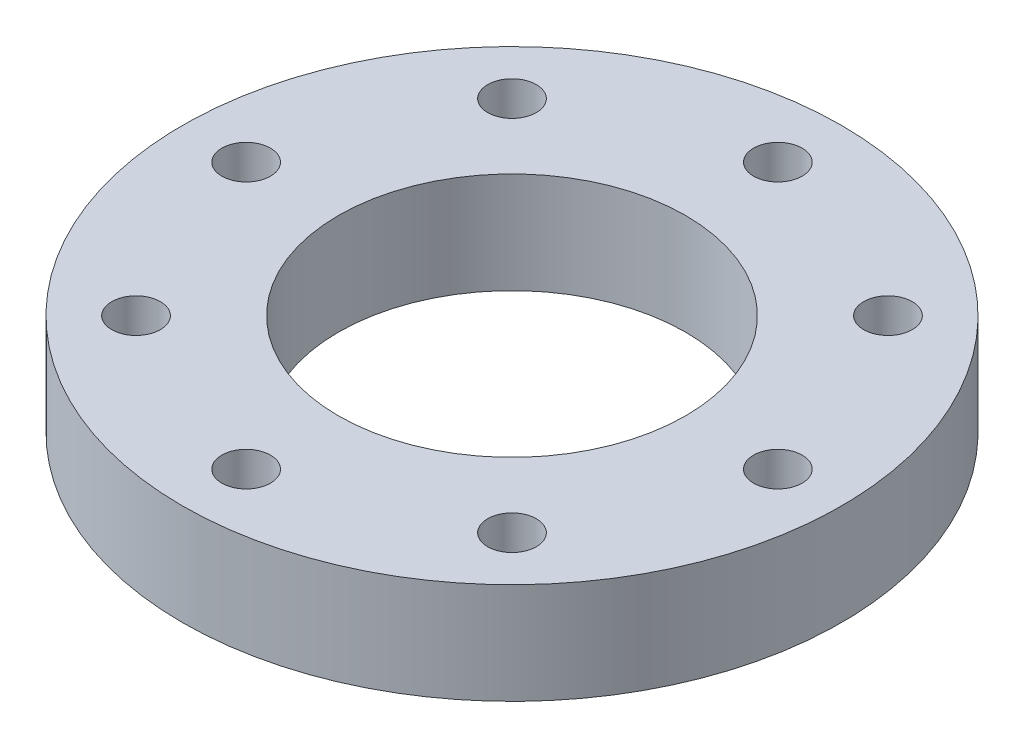
ISO-10303-21;
HEADER;
FILE_DESCRIPTION(('STEP AP214'),'2;1');
FILE_NAME('part.step','',(''),(''),'','','');
FILE_SCHEMA(('AUTOMOTIVE_DESIGN { 1 0 10303 214 1 1 1 1 }'));
ENDSEC;
DATA;
#1=APPLICATION_CONTEXT('core data for automotive mechanical design processes');
#2=APPLICATION_PROTOCOL_DEFINITION('international standard','automotive_design',2000,#1);
#3=PRODUCT_CONTEXT('',#1,'mechanical');
#4=PRODUCT('Part','Part','',(#3));
#5=PRODUCT_RELATED_PRODUCT_CATEGORY('part','',(#4));
#6=PRODUCT_DEFINITION_FORMATION('','',#4);
#7=PRODUCT_DEFINITION_CONTEXT('part definition',#1,'design');
#8=PRODUCT_DEFINITION('design','',#6,#7);
#9=PRODUCT_DEFINITION_SHAPE('','',#8);
#10=(LENGTH_UNIT() NAMED_UNIT(*) SI_UNIT(.MILLI.,.METRE.));
#11=(NAMED_UNIT(*) PLANE_ANGLE_UNIT() SI_UNIT($,.RADIAN.));
#12=(NAMED_UNIT(*) SI_UNIT($,.STERADIAN.) SOLID_ANGLE_UNIT());
#13=UNCERTAINTY_MEASURE_WITH_UNIT(LENGTH_MEASURE(1.E-05),#10,'distance_accuracy_value','');
#14=(GEOMETRIC_REPRESENTATION_CONTEXT(3) GLOBAL_UNCERTAINTY_ASSIGNED_CONTEXT((#13)) GLOBAL_UNIT_ASSIGNED_CONTEXT((#10,
#11,#12)) REPRESENTATION_CONTEXT('',''));
#15=CARTESIAN_POINT('',(0.,0.,0.));
#16=DIRECTION('',(0.,0.,1.));
#17=DIRECTION('',(1.,0.,0.));
#18=AXIS2_PLACEMENT_3D('',#15,#16,#17);
#19=CARTESIAN_POINT('',(0.,17.526,0.));
#20=DIRECTION('',(0.,1.,0.));
#21=DIRECTION('',(0.,0.,1.));
#22=AXIS2_PLACEMENT_3D('',#19,#20,#21);
#23=PLANE('',#22);
#24=CARTESIAN_POINT('',(46.101,17.526,-4.82882343606022E-13));
#25=DIRECTION('',(0.,1.,0.));
#26=DIRECTION('',(-1.,0.,0.));
#27=AXIS2_PLACEMENT_3D('',#24,#25,#26);
#28=CIRCLE('',#27,4.2164);
#29=CARTESIAN_POINT('',(41.8846,17.526,-4.38717897854727E-13));
#30=VERTEX_POINT('',#29);
#31=EDGE_CURVE('E86',#30,#30,#28,.T.);
#32=ORIENTED_EDGE('',*,*,#31,.F.);
#33=EDGE_LOOP('',(#32));
#34=FACE_BOUND('',#33,.T.);
#35=CARTESIAN_POINT('',(3.21921562404015E-13,17.526,46.101));
#36=DIRECTION('',(0.,1.,0.));
#37=DIRECTION('',(0.,0.,-1.));
#38=AXIS2_PLACEMENT_3D('',#35,#36,#37);
#39=CIRCLE('',#38,4.2164);
#40=CARTESIAN_POINT('',(2.92478598569818E-13,17.526,41.8846));
#41=VERTEX_POINT('',#40);
#42=EDGE_CURVE('E74',#41,#41,#39,.T.);
#43=ORIENTED_EDGE('',*,*,#42,.F.);
#44=EDGE_LOOP('',(#43));
#45=FACE_BOUND('',#44,.T.);
#46=CARTESIAN_POINT('',(-46.101,17.526,1.60960781202007E-13));
#47=DIRECTION('',(0.,1.,0.));
#48=DIRECTION('',(1.,0.,0.));
#49=AXIS2_PLACEMENT_3D('',#46,#47,#48);
#50=CIRCLE('',#49,4.2164);
#51=CARTESIAN_POINT('',(-41.8846,17.526,1.46239299284909E-13));
#52=VERTEX_POINT('',#51);
#53=EDGE_CURVE('E62',#52,#52,#50,.T.);
#54=ORIENTED_EDGE('',*,*,#53,.F.);
#55=EDGE_LOOP('',(#54));
#56=FACE_BOUND('',#55,.T.);
#57=CARTESIAN_POINT('',(0.,17.526,-46.101));
#58=DIRECTION('',(0.,1.,0.));
#59=DIRECTION('',(0.,0.,1.));
#60=AXIS2_PLACEMENT_3D('',#57,#58,#59);
#61=CIRCLE('',#60,4.2164);
#62=CARTESIAN_POINT('',(0.,17.526,-41.8846));
#63=VERTEX_POINT('',#62);
#64=EDGE_CURVE('E50',#63,#63,#61,.T.);
#65=ORIENTED_EDGE('',*,*,#64,.F.);
#66=EDGE_LOOP('',(#65));
#67=FACE_BOUND('',#66,.T.);
#68=CARTESIAN_POINT('',(0.,17.526,0.));
#69=DIRECTION('',(0.,1.,0.));
#70=DIRECTION('',(0.,0.,1.));
#71=AXIS2_PLACEMENT_3D('',#68,#69,#70);
#72=CIRCLE('',#71,57.15);
#73=CARTESIAN_POINT('',(0.,17.526,57.15));
#74=VERTEX_POINT('',#73);
#75=EDGE_CURVE('E11',#74,#74,#72,.T.);
#76=ORIENTED_EDGE('',*,*,#75,.T.);
#77=EDGE_LOOP('',(#76));
#78=FACE_BOUND('',#77,.T.);
#79=CARTESIAN_POINT('',(0.,17.526,0.));
#80=DIRECTION('',(0.,1.,0.));
#81=DIRECTION('',(1.,0.,0.));
#82=AXIS2_PLACEMENT_3D('',#79,#80,#81);
#83=CIRCLE('',#82,30.099);
#84=CARTESIAN_POINT('',(30.099,17.526,0.));
#85=VERTEX_POINT('',#84);
#86=EDGE_CURVE('E45',#85,#85,#83,.T.);
#87=ORIENTED_EDGE('',*,*,#86,.F.);
#88=EDGE_LOOP('',(#87));
#89=FACE_BOUND('',#88,.T.);
#90=CARTESIAN_POINT('',(-32.5983297194811,17.526,-32.598329719481));
#91=DIRECTION('',(0.,1.,0.));
#92=DIRECTION('',(0.707106781186549,0.,0.707106781186546));
#93=AXIS2_PLACEMENT_3D('',#90,#91,#92);
#94=CIRCLE('',#93,4.2164);
#95=CARTESIAN_POINT('',(-29.6168846872861,17.526,-29.616884687286));
#96=VERTEX_POINT('',#95);
#97=EDGE_CURVE('E56',#96,#96,#94,.T.);
#98=ORIENTED_EDGE('',*,*,#97,.F.);
#99=EDGE_LOOP('',(#98));
#100=FACE_BOUND('',#99,.T.);
#101=CARTESIAN_POINT('',(-32.5983297194809,17.526,32.5983297194812));
#102=DIRECTION('',(0.,1.,0.));
#103=DIRECTION('',(0.707106781186544,0.,-0.707106781186551));
#104=AXIS2_PLACEMENT_3D('',#101,#102,#103);
#105=CIRCLE('',#104,4.2164);
#106=CARTESIAN_POINT('',(-29.6168846872859,17.526,29.6168846872862));
#107=VERTEX_POINT('',#106);
#108=EDGE_CURVE('E68',#107,#107,#105,.T.);
#109=ORIENTED_EDGE('',*,*,#108,.F.);
#110=EDGE_LOOP('',(#109));
#111=FACE_BOUND('',#110,.T.);
#112=CARTESIAN_POINT('',(32.5983297194813,17.526,32.5983297194807));
#113=DIRECTION('',(0.,1.,0.));
#114=DIRECTION('',(-0.707106781186554,0.,-0.707106781186541));
#115=AXIS2_PLACEMENT_3D('',#112,#113,#114);
#116=CIRCLE('',#115,4.2164);
#117=CARTESIAN_POINT('',(29.6168846872863,17.526,29.6168846872858));
#118=VERTEX_POINT('',#117);
#119=EDGE_CURVE('E80',#118,#118,#116,.T.);
#120=ORIENTED_EDGE('',*,*,#119,.F.);
#121=EDGE_LOOP('',(#120));
#122=FACE_BOUND('',#121,.T.);
#123=CARTESIAN_POINT('',(32.5983297194806,17.526,-32.5983297194814));
#124=DIRECTION('',(0.,1.,0.));
#125=DIRECTION('',(-0.707106781186539,0.,0.707106781186556));
#126=AXIS2_PLACEMENT_3D('',#123,#124,#125);
#127=CIRCLE('',#126,4.2164);
#128=CARTESIAN_POINT('',(29.6168846872857,17.526,-29.6168846872864));
#129=VERTEX_POINT('',#128);
#130=EDGE_CURVE('E92',#129,#129,#127,.T.);
#131=ORIENTED_EDGE('',*,*,#130,.F.);
#132=EDGE_LOOP('',(#131));
#133=FACE_BOUND('',#132,.T.);
#134=ADVANCED_FACE('F34',(#34,#45,#56,#67,#78,#89,#100,#111,#122,#133),#23,.T.);
#135=CARTESIAN_POINT('',(0.,0.,0.));
#136=DIRECTION('',(0.,1.,0.));
#137=DIRECTION('',(0.,0.,1.));
#138=AXIS2_PLACEMENT_3D('',#135,#136,#137);
#139=PLANE('',#138);
#140=CARTESIAN_POINT('',(46.101,0.,-4.82882343606022E-13));
#141=DIRECTION('',(0.,1.,0.));
#142=DIRECTION('',(-1.,0.,0.));
#143=AXIS2_PLACEMENT_3D('',#140,#141,#142);
#144=CIRCLE('',#143,4.2164);
#145=CARTESIAN_POINT('',(41.8846,0.,-4.38717897854727E-13));
#146=VERTEX_POINT('',#145);
#147=EDGE_CURVE('E89',#146,#146,#144,.T.);
#148=ORIENTED_EDGE('',*,*,#147,.T.);
#149=EDGE_LOOP('',(#148));
#150=FACE_BOUND('',#149,.T.);
#151=CARTESIAN_POINT('',(3.21921562404015E-13,0.,46.101));
#152=DIRECTION('',(0.,1.,0.));
#153=DIRECTION('',(0.,0.,-1.));
#154=AXIS2_PLACEMENT_3D('',#151,#152,#153);
#155=CIRCLE('',#154,4.2164);
#156=CARTESIAN_POINT('',(2.92478598569818E-13,0.,41.8846));
#157=VERTEX_POINT('',#156);
#158=EDGE_CURVE('E77',#157,#157,#155,.T.);
#159=ORIENTED_EDGE('',*,*,#158,.T.);
#160=EDGE_LOOP('',(#159));
#161=FACE_BOUND('',#160,.T.);
#162=CARTESIAN_POINT('',(-46.101,0.,1.60960781202007E-13));
#163=DIRECTION('',(0.,1.,0.));
#164=DIRECTION('',(1.,0.,0.));
#165=AXIS2_PLACEMENT_3D('',#162,#163,#164);
#166=CIRCLE('',#165,4.2164);
#167=CARTESIAN_POINT('',(-41.8846,0.,1.46239299284909E-13));
#168=VERTEX_POINT('',#167);
#169=EDGE_CURVE('E65',#168,#168,#166,.T.);
#170=ORIENTED_EDGE('',*,*,#169,.T.);
#171=EDGE_LOOP('',(#170));
#172=FACE_BOUND('',#171,.T.);
#173=CARTESIAN_POINT('',(0.,0.,-46.101));
#174=DIRECTION('',(0.,1.,0.));
#175=DIRECTION('',(0.,0.,1.));
#176=AXIS2_PLACEMENT_3D('',#173,#174,#175);
#177=CIRCLE('',#176,4.2164);
#178=CARTESIAN_POINT('',(0.,0.,-41.8846));
#179=VERTEX_POINT('',#178);
#180=EDGE_CURVE('E53',#179,#179,#177,.T.);
#181=ORIENTED_EDGE('',*,*,#180,.T.);
#182=EDGE_LOOP('',(#181));
#183=FACE_BOUND('',#182,.T.);
#184=CARTESIAN_POINT('',(0.,0.,0.));
#185=DIRECTION('',(0.,1.,0.));
#186=DIRECTION('',(0.,0.,1.));
#187=AXIS2_PLACEMENT_3D('',#184,#185,#186);
#188=CIRCLE('',#187,57.15);
#189=CARTESIAN_POINT('',(0.,0.,57.15));
#190=VERTEX_POINT('',#189);
#191=EDGE_CURVE('E38',#190,#190,#188,.T.);
#192=ORIENTED_EDGE('',*,*,#191,.F.);
#193=EDGE_LOOP('',(#192));
#194=FACE_BOUND('',#193,.T.);
#195=CARTESIAN_POINT('',(0.,0.,0.));
#196=DIRECTION('',(0.,1.,0.));
#197=DIRECTION('',(1.,0.,0.));
#198=AXIS2_PLACEMENT_3D('',#195,#196,#197);
#199=CIRCLE('',#198,30.099);
#200=CARTESIAN_POINT('',(30.099,0.,0.));
#201=VERTEX_POINT('',#200);
#202=EDGE_CURVE('E47',#201,#201,#199,.T.);
#203=ORIENTED_EDGE('',*,*,#202,.T.);
#204=EDGE_LOOP('',(#203));
#205=FACE_BOUND('',#204,.T.);
#206=CARTESIAN_POINT('',(-32.5983297194811,0.,-32.598329719481));
#207=DIRECTION('',(0.,1.,0.));
#208=DIRECTION('',(0.707106781186549,0.,0.707106781186546));
#209=AXIS2_PLACEMENT_3D('',#206,#207,#208);
#210=CIRCLE('',#209,4.2164);
#211=CARTESIAN_POINT('',(-29.6168846872861,0.,-29.616884687286));
#212=VERTEX_POINT('',#211);
#213=EDGE_CURVE('E59',#212,#212,#210,.T.);
#214=ORIENTED_EDGE('',*,*,#213,.T.);
#215=EDGE_LOOP('',(#214));
#216=FACE_BOUND('',#215,.T.);
#217=CARTESIAN_POINT('',(-32.5983297194809,0.,32.5983297194812));
#218=DIRECTION('',(0.,1.,0.));
#219=DIRECTION('',(0.707106781186544,0.,-0.707106781186551));
#220=AXIS2_PLACEMENT_3D('',#217,#218,#219);
#221=CIRCLE('',#220,4.2164);
#222=CARTESIAN_POINT('',(-29.6168846872859,0.,29.6168846872862));
#223=VERTEX_POINT('',#222);
#224=EDGE_CURVE('E71',#223,#223,#221,.T.);
#225=ORIENTED_EDGE('',*,*,#224,.T.);
#226=EDGE_LOOP('',(#225));
#227=FACE_BOUND('',#226,.T.);
#228=CARTESIAN_POINT('',(32.5983297194813,0.,32.5983297194807));
#229=DIRECTION('',(0.,1.,0.));
#230=DIRECTION('',(-0.707106781186554,0.,-0.707106781186541));
#231=AXIS2_PLACEMENT_3D('',#228,#229,#230);
#232=CIRCLE('',#231,4.2164);
#233=CARTESIAN_POINT('',(29.6168846872863,0.,29.6168846872858));
#234=VERTEX_POINT('',#233);
#235=EDGE_CURVE('E83',#234,#234,#232,.T.);
#236=ORIENTED_EDGE('',*,*,#235,.T.);
#237=EDGE_LOOP('',(#236));
#238=FACE_BOUND('',#237,.T.);
#239=CARTESIAN_POINT('',(32.5983297194806,0.,-32.5983297194814));
#240=DIRECTION('',(0.,1.,0.));
#241=DIRECTION('',(-0.707106781186539,0.,0.707106781186556));
#242=AXIS2_PLACEMENT_3D('',#239,#240,#241);
#243=CIRCLE('',#242,4.2164);
#244=CARTESIAN_POINT('',(29.6168846872857,0.,-29.6168846872864));
#245=VERTEX_POINT('',#244);
#246=EDGE_CURVE('E95',#245,#245,#243,.T.);
#247=ORIENTED_EDGE('',*,*,#246,.T.);
#248=EDGE_LOOP('',(#247));
#249=FACE_BOUND('',#248,.T.);
#250=ADVANCED_FACE('F105',(#150,#161,#172,#183,#194,#205,#216,#227,#238,#249),#139,.F.);
#251=CARTESIAN_POINT('',(0.,17.526,0.));
#252=DIRECTION('',(0.,-1.,0.));
#253=DIRECTION('',(0.,0.,-1.));
#254=AXIS2_PLACEMENT_3D('',#251,#252,#253);
#255=CYLINDRICAL_SURFACE('',#254,57.15);
#256=ORIENTED_EDGE('',*,*,#75,.F.);
#257=EDGE_LOOP('',(#256));
#258=FACE_BOUND('',#257,.T.);
#259=ORIENTED_EDGE('',*,*,#191,.T.);
#260=EDGE_LOOP('',(#259));
#261=FACE_BOUND('',#260,.T.);
#262=ADVANCED_FACE('F36',(#258,#261),#255,.T.);
#263=CARTESIAN_POINT('',(0.,17.526,0.));
#264=DIRECTION('',(0.,-1.,0.));
#265=DIRECTION('',(0.,0.,-1.));
#266=AXIS2_PLACEMENT_3D('',#263,#264,#265);
#267=CYLINDRICAL_SURFACE('',#266,30.099);
#268=ORIENTED_EDGE('',*,*,#86,.T.);
#269=EDGE_LOOP('',(#268));
#270=FACE_BOUND('',#269,.T.);
#271=ORIENTED_EDGE('',*,*,#202,.F.);
#272=EDGE_LOOP('',(#271));
#273=FACE_BOUND('',#272,.T.);
#274=ADVANCED_FACE('F115',(#270,#273),#267,.F.);
#275=CARTESIAN_POINT('',(0.,17.526,-46.101));
#276=DIRECTION('',(0.,-1.,0.));
#277=DIRECTION('',(0.,0.,-1.));
#278=AXIS2_PLACEMENT_3D('',#275,#276,#277);
#279=CYLINDRICAL_SURFACE('',#278,4.2164);
#280=ORIENTED_EDGE('',*,*,#64,.T.);
#281=EDGE_LOOP('',(#280));
#282=FACE_BOUND('',#281,.T.);
#283=ORIENTED_EDGE('',*,*,#180,.F.);
#284=EDGE_LOOP('',(#283));
#285=FACE_BOUND('',#284,.T.);
#286=ADVANCED_FACE('F118',(#282,#285),#279,.F.);
#287=CARTESIAN_POINT('',(-32.5983297194811,17.526,-32.598329719481));
#288=DIRECTION('',(0.,-1.,0.));
#289=DIRECTION('',(0.,0.,-1.));
#290=AXIS2_PLACEMENT_3D('',#287,#288,#289);
#291=CYLINDRICAL_SURFACE('',#290,4.2164);
#292=ORIENTED_EDGE('',*,*,#97,.T.);
#293=EDGE_LOOP('',(#292));
#294=FACE_BOUND('',#293,.T.);
#295=ORIENTED_EDGE('',*,*,#213,.F.);
#296=EDGE_LOOP('',(#295));
#297=FACE_BOUND('',#296,.T.);
#298=ADVANCED_FACE('F122',(#294,#297),#291,.F.);
#299=CARTESIAN_POINT('',(-46.101,17.526,1.60960781202007E-13));
#300=DIRECTION('',(0.,-1.,0.));
#301=DIRECTION('',(0.,0.,-1.));
#302=AXIS2_PLACEMENT_3D('',#299,#300,#301);
#303=CYLINDRICAL_SURFACE('',#302,4.2164);
#304=ORIENTED_EDGE('',*,*,#53,.T.);
#305=EDGE_LOOP('',(#304));
#306=FACE_BOUND('',#305,.T.);
#307=ORIENTED_EDGE('',*,*,#169,.F.);
#308=EDGE_LOOP('',(#307));
#309=FACE_BOUND('',#308,.T.);
#310=ADVANCED_FACE('F126',(#306,#309),#303,.F.);
#311=CARTESIAN_POINT('',(-32.5983297194809,17.526,32.5983297194812));
#312=DIRECTION('',(0.,-1.,0.));
#313=DIRECTION('',(0.,0.,-1.));
#314=AXIS2_PLACEMENT_3D('',#311,#312,#313);
#315=CYLINDRICAL_SURFACE('',#314,4.2164);
#316=ORIENTED_EDGE('',*,*,#108,.T.);
#317=EDGE_LOOP('',(#316));
#318=FACE_BOUND('',#317,.T.);
#319=ORIENTED_EDGE('',*,*,#224,.F.);
#320=EDGE_LOOP('',(#319));
#321=FACE_BOUND('',#320,.T.);
#322=ADVANCED_FACE('F130',(#318,#321),#315,.F.);
#323=CARTESIAN_POINT('',(3.21921562404015E-13,17.526,46.101));
#324=DIRECTION('',(0.,-1.,0.));
#325=DIRECTION('',(0.,0.,-1.));
#326=AXIS2_PLACEMENT_3D('',#323,#324,#325);
#327=CYLINDRICAL_SURFACE('',#326,4.2164);
#328=ORIENTED_EDGE('',*,*,#42,.T.);
#329=EDGE_LOOP('',(#328));
#330=FACE_BOUND('',#329,.T.);
#331=ORIENTED_EDGE('',*,*,#158,.F.);
#332=EDGE_LOOP('',(#331));
#333=FACE_BOUND('',#332,.T.);
#334=ADVANCED_FACE('F134',(#330,#333),#327,.F.);
#335=CARTESIAN_POINT('',(32.5983297194813,17.526,32.5983297194807));
#336=DIRECTION('',(0.,-1.,0.));
#337=DIRECTION('',(0.,0.,-1.));
#338=AXIS2_PLACEMENT_3D('',#335,#336,#337);
#339=CYLINDRICAL_SURFACE('',#338,4.2164);
#340=ORIENTED_EDGE('',*,*,#119,.T.);
#341=EDGE_LOOP('',(#340));
#342=FACE_BOUND('',#341,.T.);
#343=ORIENTED_EDGE('',*,*,#235,.F.);
#344=EDGE_LOOP('',(#343));
#345=FACE_BOUND('',#344,.T.);
#346=ADVANCED_FACE('F138',(#342,#345),#339,.F.);
#347=CARTESIAN_POINT('',(46.101,17.526,-4.82882343606022E-13));
#348=DIRECTION('',(0.,-1.,0.));
#349=DIRECTION('',(0.,0.,-1.));
#350=AXIS2_PLACEMENT_3D('',#347,#348,#349);
#351=CYLINDRICAL_SURFACE('',#350,4.2164);
#352=ORIENTED_EDGE('',*,*,#31,.T.);
#353=EDGE_LOOP('',(#352));
#354=FACE_BOUND('',#353,.T.);
#355=ORIENTED_EDGE('',*,*,#147,.F.);
#356=EDGE_LOOP('',(#355));
#357=FACE_BOUND('',#356,.T.);
#358=ADVANCED_FACE('F142',(#354,#357),#351,.F.);
#359=CARTESIAN_POINT('',(32.5983297194806,17.526,-32.5983297194814));
#360=DIRECTION('',(0.,-1.,0.));
#361=DIRECTION('',(0.,0.,-1.));
#362=AXIS2_PLACEMENT_3D('',#359,#360,#361);
#363=CYLINDRICAL_SURFACE('',#362,4.2164);
#364=ORIENTED_EDGE('',*,*,#130,.T.);
#365=EDGE_LOOP('',(#364));
#366=FACE_BOUND('',#365,.T.);
#367=ORIENTED_EDGE('',*,*,#246,.F.);
#368=EDGE_LOOP('',(#367));
#369=FACE_BOUND('',#368,.T.);
#370=ADVANCED_FACE('F101',(#366,#369),#363,.F.);
#371=CLOSED_SHELL('',(#134,#250,#262,#274,#286,#298,#310,#322,#334,#346,#358,#370));
#372=MANIFOLD_SOLID_BREP('B2',#371);
#373=ADVANCED_BREP_SHAPE_REPRESENTATION('',(#18,#372),#14);
#374=SHAPE_DEFINITION_REPRESENTATION(#9,#373);
ENDSEC;
END-ISO-10303-21;
